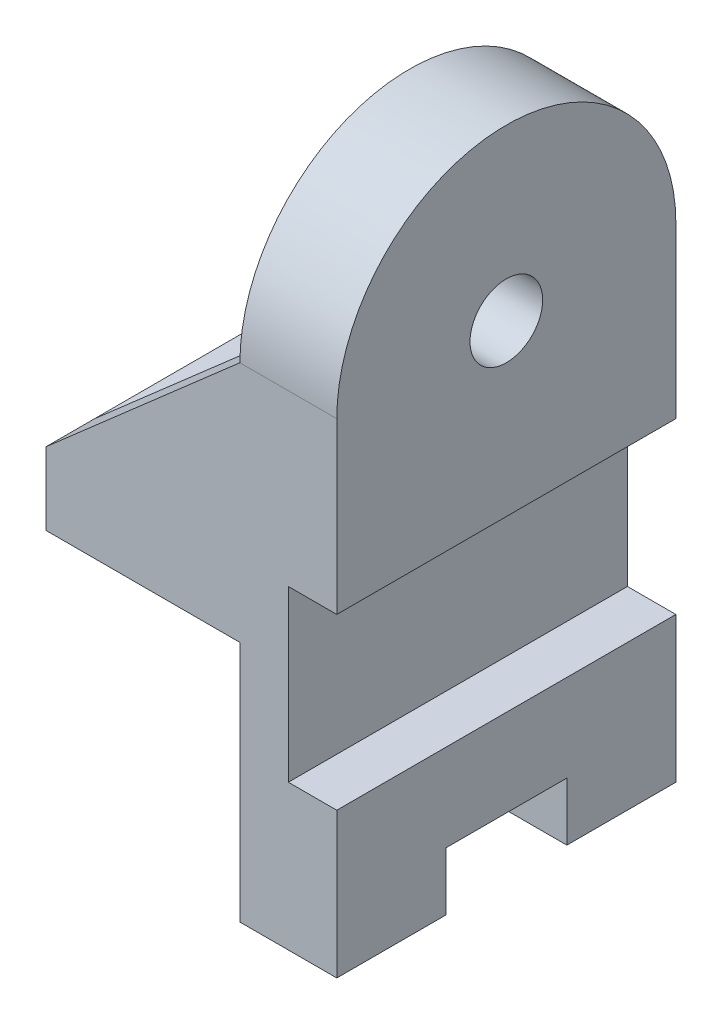
ISO-10303-21;
HEADER;
FILE_DESCRIPTION(('STEP AP214'),'2;1');
FILE_NAME('part.step','',(''),(''),'','','');
FILE_SCHEMA(('AUTOMOTIVE_DESIGN { 1 0 10303 214 1 1 1 1 }'));
ENDSEC;
DATA;
#1=APPLICATION_CONTEXT('core data for automotive mechanical design processes');
#2=APPLICATION_PROTOCOL_DEFINITION('international standard','automotive_design',2000,#1);
#3=PRODUCT_CONTEXT('',#1,'mechanical');
#4=PRODUCT('Part','Part','',(#3));
#5=PRODUCT_RELATED_PRODUCT_CATEGORY('part','',(#4));
#6=PRODUCT_DEFINITION_FORMATION('','',#4);
#7=PRODUCT_DEFINITION_CONTEXT('part definition',#1,'design');
#8=PRODUCT_DEFINITION('design','',#6,#7);
#9=PRODUCT_DEFINITION_SHAPE('','',#8);
#10=(LENGTH_UNIT() NAMED_UNIT(*) SI_UNIT(.MILLI.,.METRE.));
#11=(NAMED_UNIT(*) PLANE_ANGLE_UNIT() SI_UNIT($,.RADIAN.));
#12=(NAMED_UNIT(*) SI_UNIT($,.STERADIAN.) SOLID_ANGLE_UNIT());
#13=UNCERTAINTY_MEASURE_WITH_UNIT(LENGTH_MEASURE(1.E-05),#10,'distance_accuracy_value','');
#14=(GEOMETRIC_REPRESENTATION_CONTEXT(3) GLOBAL_UNCERTAINTY_ASSIGNED_CONTEXT((#13)) GLOBAL_UNIT_ASSIGNED_CONTEXT((#10,
#11,#12)) REPRESENTATION_CONTEXT('',''));
#15=CARTESIAN_POINT('',(0.,0.,0.));
#16=DIRECTION('',(0.,0.,1.));
#17=DIRECTION('',(1.,0.,0.));
#18=AXIS2_PLACEMENT_3D('',#15,#16,#17);
#19=CARTESIAN_POINT('',(-20.,15.,-77.7200187265877));
#20=DIRECTION('',(0.,1.,0.));
#21=DIRECTION('',(-1.,0.,0.));
#22=AXIS2_PLACEMENT_3D('',#19,#20,#21);
#23=PLANE('',#22);
#24=CARTESIAN_POINT('',(-40.,15.,0.));
#25=DIRECTION('',(0.,1.,0.));
#26=DIRECTION('',(-1.,0.,0.));
#27=AXIS2_PLACEMENT_3D('',#24,#25,#26);
#28=CIRCLE('',#27,6.);
#29=CARTESIAN_POINT('',(-46.,15.,0.));
#30=VERTEX_POINT('',#29);
#31=EDGE_CURVE('E346',#30,#30,#28,.T.);
#32=ORIENTED_EDGE('',*,*,#31,.F.);
#33=EDGE_LOOP('',(#32));
#34=FACE_BOUND('',#33,.T.);
#35=DIRECTION('',(0.,0.,1.));
#36=VECTOR('',#35,1.);
#37=CARTESIAN_POINT('',(-20.,15.,-77.7200187265877));
#38=LINE('',#37,#36);
#39=CARTESIAN_POINT('',(-20.,15.,-25.));
#40=VERTEX_POINT('',#39);
#41=CARTESIAN_POINT('',(-20.,15.,25.));
#42=VERTEX_POINT('',#41);
#43=EDGE_CURVE('E41',#40,#42,#38,.T.);
#44=ORIENTED_EDGE('',*,*,#43,.F.);
#45=DIRECTION('',(1.,0.,0.));
#46=VECTOR('',#45,1.);
#47=CARTESIAN_POINT('',(-20.,15.,-25.));
#48=LINE('',#47,#46);
#49=CARTESIAN_POINT('',(-60.,15.,-25.));
#50=VERTEX_POINT('',#49);
#51=EDGE_CURVE('E178',#50,#40,#48,.T.);
#52=ORIENTED_EDGE('',*,*,#51,.F.);
#53=DIRECTION('',(0.,0.,1.));
#54=VECTOR('',#53,1.);
#55=CARTESIAN_POINT('',(-60.,15.,-77.7200187265877));
#56=LINE('',#55,#54);
#57=CARTESIAN_POINT('',(-60.,15.,25.));
#58=VERTEX_POINT('',#57);
#59=EDGE_CURVE('E163',#50,#58,#56,.T.);
#60=ORIENTED_EDGE('',*,*,#59,.T.);
#61=DIRECTION('',(1.,0.,0.));
#62=VECTOR('',#61,1.);
#63=CARTESIAN_POINT('',(-20.,15.,25.));
#64=LINE('',#63,#62);
#65=EDGE_CURVE('E491',#58,#42,#64,.T.);
#66=ORIENTED_EDGE('',*,*,#65,.T.);
#67=EDGE_LOOP('',(#44,#52,#60,#66));
#68=FACE_BOUND('',#67,.T.);
#69=ADVANCED_FACE('F37',(#34,#68),#23,.T.);
#70=CARTESIAN_POINT('',(-20.,0.,0.));
#71=DIRECTION('',(1.,0.,0.));
#72=DIRECTION('',(0.,0.,-1.));
#73=AXIS2_PLACEMENT_3D('',#70,#71,#72);
#74=PLANE('',#73);
#75=CARTESIAN_POINT('',(-20.,50.,0.));
#76=DIRECTION('',(1.,0.,0.));
#77=DIRECTION('',(0.,0.,-1.));
#78=AXIS2_PLACEMENT_3D('',#75,#76,#77);
#79=CIRCLE('',#78,7.5);
#80=CARTESIAN_POINT('',(-20.,50.,-7.5));
#81=VERTEX_POINT('',#80);
#82=EDGE_CURVE('E224',#81,#81,#79,.T.);
#83=ORIENTED_EDGE('',*,*,#82,.T.);
#84=EDGE_LOOP('',(#83));
#85=FACE_BOUND('',#84,.T.);
#86=DIRECTION('',(0.,0.,-1.));
#87=VECTOR('',#86,1.);
#88=CARTESIAN_POINT('',(-20.,50.,-25.));
#89=LINE('',#88,#87);
#90=CARTESIAN_POINT('',(-20.,50.,-25.));
#91=VERTEX_POINT('',#90);
#92=CARTESIAN_POINT('',(-20.,50.,-35.));
#93=VERTEX_POINT('',#92);
#94=EDGE_CURVE('E55',#91,#93,#89,.T.);
#95=ORIENTED_EDGE('',*,*,#94,.F.);
#96=DIRECTION('',(0.,1.,0.));
#97=VECTOR('',#96,1.);
#98=CARTESIAN_POINT('',(-20.,50.,-25.));
#99=LINE('',#98,#97);
#100=EDGE_CURVE('E59',#40,#91,#99,.T.);
#101=ORIENTED_EDGE('',*,*,#100,.F.);
#102=ORIENTED_EDGE('',*,*,#43,.T.);
#103=DIRECTION('',(0.,1.,0.));
#104=VECTOR('',#103,1.);
#105=CARTESIAN_POINT('',(-20.,50.,25.));
#106=LINE('',#105,#104);
#107=CARTESIAN_POINT('',(-20.,50.,25.));
#108=VERTEX_POINT('',#107);
#109=EDGE_CURVE('E493',#42,#108,#106,.T.);
#110=ORIENTED_EDGE('',*,*,#109,.T.);
#111=DIRECTION('',(0.,0.,1.));
#112=VECTOR('',#111,1.);
#113=CARTESIAN_POINT('',(-20.,50.,25.));
#114=LINE('',#113,#112);
#115=CARTESIAN_POINT('',(-20.,50.,35.));
#116=VERTEX_POINT('',#115);
#117=EDGE_CURVE('E489',#108,#116,#114,.T.);
#118=ORIENTED_EDGE('',*,*,#117,.T.);
#119=CARTESIAN_POINT('',(-20.,50.,0.));
#120=DIRECTION('',(1.,0.,0.));
#121=DIRECTION('',(0.,0.,-1.));
#122=AXIS2_PLACEMENT_3D('',#119,#120,#121);
#123=CIRCLE('',#122,35.);
#124=EDGE_CURVE('E231',#93,#116,#123,.T.);
#125=ORIENTED_EDGE('',*,*,#124,.F.);
#126=EDGE_LOOP('',(#95,#101,#102,#110,#118,#125));
#127=FACE_BOUND('',#126,.T.);
#128=ADVANCED_FACE('F371',(#85,#127),#74,.F.);
#129=DIRECTION('',(0.,0.,1.));
#130=VECTOR('',#129,1.);
#131=CARTESIAN_POINT('',(-20.,0.,-77.7200187265877));
#132=LINE('',#131,#130);
#133=CARTESIAN_POINT('',(-20.,0.,-35.));
#134=VERTEX_POINT('',#133);
#135=CARTESIAN_POINT('',(-20.,0.,35.));
#136=VERTEX_POINT('',#135);
#137=EDGE_CURVE('E243',#134,#136,#132,.T.);
#138=ORIENTED_EDGE('',*,*,#137,.F.);
#139=DIRECTION('',(0.,1.,0.));
#140=VECTOR('',#139,1.);
#141=CARTESIAN_POINT('',(-20.,0.,-35.));
#142=LINE('',#141,#140);
#143=CARTESIAN_POINT('',(-20.,-50.,-35.));
#144=VERTEX_POINT('',#143);
#145=EDGE_CURVE('E227',#144,#134,#142,.T.);
#146=ORIENTED_EDGE('',*,*,#145,.F.);
#147=DIRECTION('',(0.,0.,-1.));
#148=VECTOR('',#147,1.);
#149=CARTESIAN_POINT('',(-20.,-50.,0.));
#150=LINE('',#149,#148);
#151=CARTESIAN_POINT('',(-20.,-50.,-12.5));
#152=VERTEX_POINT('',#151);
#153=EDGE_CURVE('E250',#152,#144,#150,.T.);
#154=ORIENTED_EDGE('',*,*,#153,.F.);
#155=DIRECTION('',(0.,-1.,0.));
#156=VECTOR('',#155,1.);
#157=CARTESIAN_POINT('',(-20.,0.,-12.5));
#158=LINE('',#157,#156);
#159=CARTESIAN_POINT('',(-20.,-38.,-12.5));
#160=VERTEX_POINT('',#159);
#161=EDGE_CURVE('E255',#160,#152,#158,.T.);
#162=ORIENTED_EDGE('',*,*,#161,.F.);
#163=DIRECTION('',(0.,0.,-1.));
#164=VECTOR('',#163,1.);
#165=CARTESIAN_POINT('',(-20.,-38.,0.));
#166=LINE('',#165,#164);
#167=CARTESIAN_POINT('',(-20.,-38.,12.5));
#168=VERTEX_POINT('',#167);
#169=EDGE_CURVE('E252',#168,#160,#166,.T.);
#170=ORIENTED_EDGE('',*,*,#169,.F.);
#171=DIRECTION('',(0.,-1.,0.));
#172=VECTOR('',#171,1.);
#173=CARTESIAN_POINT('',(-20.,0.,12.5));
#174=LINE('',#173,#172);
#175=CARTESIAN_POINT('',(-20.,-50.,12.5));
#176=VERTEX_POINT('',#175);
#177=EDGE_CURVE('E249',#168,#176,#174,.T.);
#178=ORIENTED_EDGE('',*,*,#177,.T.);
#179=CARTESIAN_POINT('',(-20.,-50.,35.));
#180=VERTEX_POINT('',#179);
#181=EDGE_CURVE('E242',#180,#176,#150,.T.);
#182=ORIENTED_EDGE('',*,*,#181,.F.);
#183=DIRECTION('',(0.,1.,0.));
#184=VECTOR('',#183,1.);
#185=CARTESIAN_POINT('',(-20.,0.,35.));
#186=LINE('',#185,#184);
#187=EDGE_CURVE('E239',#180,#136,#186,.T.);
#188=ORIENTED_EDGE('',*,*,#187,.T.);
#189=EDGE_LOOP('',(#138,#146,#154,#162,#170,#178,#182,#188));
#190=FACE_BOUND('',#189,.T.);
#191=ADVANCED_FACE('F310',(#190),#74,.F.);
#192=CARTESIAN_POINT('',(0.,0.,0.));
#193=DIRECTION('',(1.,0.,0.));
#194=DIRECTION('',(0.,0.,-1.));
#195=AXIS2_PLACEMENT_3D('',#192,#193,#194);
#196=PLANE('',#195);
#197=DIRECTION('',(0.,0.,-1.));
#198=VECTOR('',#197,1.);
#199=CARTESIAN_POINT('',(0.,15.,35.));
#200=LINE('',#199,#198);
#201=CARTESIAN_POINT('',(0.,15.,35.));
#202=VERTEX_POINT('',#201);
#203=CARTESIAN_POINT('',(0.,15.,-35.));
#204=VERTEX_POINT('',#203);
#205=EDGE_CURVE('E215',#202,#204,#200,.T.);
#206=ORIENTED_EDGE('',*,*,#205,.T.);
#207=DIRECTION('',(0.,1.,0.));
#208=VECTOR('',#207,1.);
#209=CARTESIAN_POINT('',(0.,0.,-35.));
#210=LINE('',#209,#208);
#211=CARTESIAN_POINT('',(0.,50.,-35.));
#212=VERTEX_POINT('',#211);
#213=EDGE_CURVE('E260',#204,#212,#210,.T.);
#214=ORIENTED_EDGE('',*,*,#213,.T.);
#215=CARTESIAN_POINT('',(0.,50.,0.));
#216=DIRECTION('',(1.,0.,0.));
#217=DIRECTION('',(0.,0.,-1.));
#218=AXIS2_PLACEMENT_3D('',#215,#216,#217);
#219=CIRCLE('',#218,35.);
#220=CARTESIAN_POINT('',(0.,50.,35.));
#221=VERTEX_POINT('',#220);
#222=EDGE_CURVE('E264',#212,#221,#219,.T.);
#223=ORIENTED_EDGE('',*,*,#222,.T.);
#224=DIRECTION('',(0.,1.,0.));
#225=VECTOR('',#224,1.);
#226=CARTESIAN_POINT('',(0.,0.,35.));
#227=LINE('',#226,#225);
#228=EDGE_CURVE('E267',#202,#221,#227,.T.);
#229=ORIENTED_EDGE('',*,*,#228,.F.);
#230=EDGE_LOOP('',(#206,#214,#223,#229));
#231=FACE_BOUND('',#230,.T.);
#232=CARTESIAN_POINT('',(0.,50.,0.));
#233=DIRECTION('',(1.,0.,0.));
#234=DIRECTION('',(0.,0.,-1.));
#235=AXIS2_PLACEMENT_3D('',#232,#233,#234);
#236=CIRCLE('',#235,7.5);
#237=CARTESIAN_POINT('',(0.,50.,-7.5));
#238=VERTEX_POINT('',#237);
#239=EDGE_CURVE('E218',#238,#238,#236,.T.);
#240=ORIENTED_EDGE('',*,*,#239,.F.);
#241=EDGE_LOOP('',(#240));
#242=FACE_BOUND('',#241,.T.);
#243=ADVANCED_FACE('F395',(#231,#242),#196,.T.);
#244=CARTESIAN_POINT('',(-20.,0.,-35.));
#245=DIRECTION('',(0.,0.,-1.));
#246=DIRECTION('',(-1.,0.,0.));
#247=AXIS2_PLACEMENT_3D('',#244,#245,#246);
#248=PLANE('',#247);
#249=DIRECTION('',(0.,-1.,0.));
#250=VECTOR('',#249,1.);
#251=CARTESIAN_POINT('',(-60.,15.,-35.));
#252=LINE('',#251,#250);
#253=CARTESIAN_POINT('',(-60.,15.,-35.));
#254=VERTEX_POINT('',#253);
#255=CARTESIAN_POINT('',(-60.,0.,-35.));
#256=VERTEX_POINT('',#255);
#257=EDGE_CURVE('E190',#254,#256,#252,.T.);
#258=ORIENTED_EDGE('',*,*,#257,.F.);
#259=DIRECTION('',(-0.752576694706878,-0.658504607868518,0.));
#260=VECTOR('',#259,1.);
#261=CARTESIAN_POINT('',(-60.,15.,-35.));
#262=LINE('',#261,#260);
#263=EDGE_CURVE('E182',#93,#254,#262,.T.);
#264=ORIENTED_EDGE('',*,*,#263,.F.);
#265=DIRECTION('',(1.,0.,0.));
#266=VECTOR('',#265,1.);
#267=CARTESIAN_POINT('',(-20.,50.,-35.));
#268=LINE('',#267,#266);
#269=EDGE_CURVE('E237',#93,#212,#268,.T.);
#270=ORIENTED_EDGE('',*,*,#269,.T.);
#271=ORIENTED_EDGE('',*,*,#213,.F.);
#272=DIRECTION('',(1.,0.,0.));
#273=VECTOR('',#272,1.);
#274=CARTESIAN_POINT('',(-9.99999999999999,15.,-35.));
#275=LINE('',#274,#273);
#276=CARTESIAN_POINT('',(-9.99999999999999,15.,-35.));
#277=VERTEX_POINT('',#276);
#278=EDGE_CURVE('E201',#277,#204,#275,.T.);
#279=ORIENTED_EDGE('',*,*,#278,.F.);
#280=DIRECTION('',(0.,1.,0.));
#281=VECTOR('',#280,1.);
#282=CARTESIAN_POINT('',(-9.99999999999999,15.,-35.));
#283=LINE('',#282,#281);
#284=CARTESIAN_POINT('',(-10.,-20.,-35.));
#285=VERTEX_POINT('',#284);
#286=EDGE_CURVE('E211',#285,#277,#283,.T.);
#287=ORIENTED_EDGE('',*,*,#286,.F.);
#288=DIRECTION('',(-1.,0.,0.));
#289=VECTOR('',#288,1.);
#290=CARTESIAN_POINT('',(-10.,-20.,-35.));
#291=LINE('',#290,#289);
#292=CARTESIAN_POINT('',(0.,-20.,-35.));
#293=VERTEX_POINT('',#292);
#294=EDGE_CURVE('E208',#293,#285,#291,.T.);
#295=ORIENTED_EDGE('',*,*,#294,.F.);
#296=CARTESIAN_POINT('',(0.,-50.,-35.));
#297=VERTEX_POINT('',#296);
#298=EDGE_CURVE('E261',#297,#293,#210,.T.);
#299=ORIENTED_EDGE('',*,*,#298,.F.);
#300=DIRECTION('',(1.,0.,0.));
#301=VECTOR('',#300,1.);
#302=CARTESIAN_POINT('',(-20.,-50.,-35.));
#303=LINE('',#302,#301);
#304=EDGE_CURVE('E11',#144,#297,#303,.T.);
#305=ORIENTED_EDGE('',*,*,#304,.F.);
#306=ORIENTED_EDGE('',*,*,#145,.T.);
#307=DIRECTION('',(1.,0.,0.));
#308=VECTOR('',#307,1.);
#309=CARTESIAN_POINT('',(-20.,0.,-35.));
#310=LINE('',#309,#308);
#311=EDGE_CURVE('E313',#256,#134,#310,.T.);
#312=ORIENTED_EDGE('',*,*,#311,.F.);
#313=EDGE_LOOP('',(#258,#264,#270,#271,#279,#287,#295,#299,#305,#306,#312));
#314=FACE_BOUND('',#313,.T.);
#315=ADVANCED_FACE('F312',(#314),#248,.T.);
#316=CARTESIAN_POINT('',(-20.,-50.,0.));
#317=DIRECTION('',(0.,-1.,0.));
#318=DIRECTION('',(0.,0.,-1.));
#319=AXIS2_PLACEMENT_3D('',#316,#317,#318);
#320=PLANE('',#319);
#321=DIRECTION('',(0.,0.,-1.));
#322=VECTOR('',#321,1.);
#323=CARTESIAN_POINT('',(0.,-50.,0.));
#324=LINE('',#323,#322);
#325=CARTESIAN_POINT('',(0.,-50.,-12.5));
#326=VERTEX_POINT('',#325);
#327=EDGE_CURVE('E228',#326,#297,#324,.T.);
#328=ORIENTED_EDGE('',*,*,#327,.F.);
#329=DIRECTION('',(1.,0.,0.));
#330=VECTOR('',#329,1.);
#331=CARTESIAN_POINT('',(-20.,-50.,-12.5));
#332=LINE('',#331,#330);
#333=EDGE_CURVE('E47',#152,#326,#332,.T.);
#334=ORIENTED_EDGE('',*,*,#333,.F.);
#335=ORIENTED_EDGE('',*,*,#153,.T.);
#336=ORIENTED_EDGE('',*,*,#304,.T.);
#337=EDGE_LOOP('',(#328,#334,#335,#336));
#338=FACE_BOUND('',#337,.T.);
#339=ADVANCED_FACE('F304',(#338),#320,.T.);
#340=CARTESIAN_POINT('',(-20.,0.,-12.5));
#341=DIRECTION('',(0.,0.,1.));
#342=DIRECTION('',(1.,0.,0.));
#343=AXIS2_PLACEMENT_3D('',#340,#341,#342);
#344=PLANE('',#343);
#345=DIRECTION('',(0.,-1.,0.));
#346=VECTOR('',#345,1.);
#347=CARTESIAN_POINT('',(0.,0.,-12.5));
#348=LINE('',#347,#346);
#349=CARTESIAN_POINT('',(0.,-38.,-12.5));
#350=VERTEX_POINT('',#349);
#351=EDGE_CURVE('E280',#350,#326,#348,.T.);
#352=ORIENTED_EDGE('',*,*,#351,.F.);
#353=DIRECTION('',(1.,0.,0.));
#354=VECTOR('',#353,1.);
#355=CARTESIAN_POINT('',(-20.,-38.,-12.5));
#356=LINE('',#355,#354);
#357=EDGE_CURVE('E284',#160,#350,#356,.T.);
#358=ORIENTED_EDGE('',*,*,#357,.F.);
#359=ORIENTED_EDGE('',*,*,#161,.T.);
#360=ORIENTED_EDGE('',*,*,#333,.T.);
#361=EDGE_LOOP('',(#352,#358,#359,#360));
#362=FACE_BOUND('',#361,.T.);
#363=ADVANCED_FACE('F325',(#362),#344,.T.);
#364=CARTESIAN_POINT('',(-20.,-38.,0.));
#365=DIRECTION('',(0.,-1.,0.));
#366=DIRECTION('',(0.,0.,-1.));
#367=AXIS2_PLACEMENT_3D('',#364,#365,#366);
#368=PLANE('',#367);
#369=DIRECTION('',(0.,0.,-1.));
#370=VECTOR('',#369,1.);
#371=CARTESIAN_POINT('',(0.,-38.,0.));
#372=LINE('',#371,#370);
#373=CARTESIAN_POINT('',(0.,-38.,12.5));
#374=VERTEX_POINT('',#373);
#375=EDGE_CURVE('E277',#374,#350,#372,.T.);
#376=ORIENTED_EDGE('',*,*,#375,.F.);
#377=DIRECTION('',(1.,0.,0.));
#378=VECTOR('',#377,1.);
#379=CARTESIAN_POINT('',(-20.,-38.,12.5));
#380=LINE('',#379,#378);
#381=EDGE_CURVE('E286',#168,#374,#380,.T.);
#382=ORIENTED_EDGE('',*,*,#381,.F.);
#383=ORIENTED_EDGE('',*,*,#169,.T.);
#384=ORIENTED_EDGE('',*,*,#357,.T.);
#385=EDGE_LOOP('',(#376,#382,#383,#384));
#386=FACE_BOUND('',#385,.T.);
#387=ADVANCED_FACE('F327',(#386),#368,.T.);
#388=CARTESIAN_POINT('',(-20.,0.,12.5));
#389=DIRECTION('',(0.,0.,1.));
#390=DIRECTION('',(0.,-1.,0.));
#391=AXIS2_PLACEMENT_3D('',#388,#389,#390);
#392=PLANE('',#391);
#393=DIRECTION('',(0.,-1.,0.));
#394=VECTOR('',#393,1.);
#395=CARTESIAN_POINT('',(0.,0.,12.5));
#396=LINE('',#395,#394);
#397=CARTESIAN_POINT('',(0.,-50.,12.5));
#398=VERTEX_POINT('',#397);
#399=EDGE_CURVE('E274',#374,#398,#396,.T.);
#400=ORIENTED_EDGE('',*,*,#399,.T.);
#401=DIRECTION('',(1.,0.,0.));
#402=VECTOR('',#401,1.);
#403=CARTESIAN_POINT('',(-20.,-50.,12.5));
#404=LINE('',#403,#402);
#405=EDGE_CURVE('E288',#176,#398,#404,.T.);
#406=ORIENTED_EDGE('',*,*,#405,.F.);
#407=ORIENTED_EDGE('',*,*,#177,.F.);
#408=ORIENTED_EDGE('',*,*,#381,.T.);
#409=EDGE_LOOP('',(#400,#406,#407,#408));
#410=FACE_BOUND('',#409,.T.);
#411=ADVANCED_FACE('F332',(#410),#392,.F.);
#412=CARTESIAN_POINT('',(0.,-50.,35.));
#413=VERTEX_POINT('',#412);
#414=EDGE_CURVE('E271',#413,#398,#324,.T.);
#415=ORIENTED_EDGE('',*,*,#414,.F.);
#416=DIRECTION('',(1.,0.,0.));
#417=VECTOR('',#416,1.);
#418=CARTESIAN_POINT('',(-20.,-50.,35.));
#419=LINE('',#418,#417);
#420=EDGE_CURVE('E290',#180,#413,#419,.T.);
#421=ORIENTED_EDGE('',*,*,#420,.F.);
#422=ORIENTED_EDGE('',*,*,#181,.T.);
#423=ORIENTED_EDGE('',*,*,#405,.T.);
#424=EDGE_LOOP('',(#415,#421,#422,#423));
#425=FACE_BOUND('',#424,.T.);
#426=ADVANCED_FACE('F335',(#425),#320,.T.);
#427=CARTESIAN_POINT('',(-20.,0.,35.));
#428=DIRECTION('',(0.,0.,-1.));
#429=DIRECTION('',(-1.,0.,0.));
#430=AXIS2_PLACEMENT_3D('',#427,#428,#429);
#431=PLANE('',#430);
#432=DIRECTION('',(1.,0.,0.));
#433=VECTOR('',#432,1.);
#434=CARTESIAN_POINT('',(-20.,50.,35.));
#435=LINE('',#434,#433);
#436=EDGE_CURVE('E291',#116,#221,#435,.T.);
#437=ORIENTED_EDGE('',*,*,#436,.F.);
#438=DIRECTION('',(-0.752576694706878,-0.658504607868518,0.));
#439=VECTOR('',#438,1.);
#440=CARTESIAN_POINT('',(-60.,15.,35.));
#441=LINE('',#440,#439);
#442=CARTESIAN_POINT('',(-60.,15.,35.));
#443=VERTEX_POINT('',#442);
#444=EDGE_CURVE('E487',#116,#443,#441,.T.);
#445=ORIENTED_EDGE('',*,*,#444,.T.);
#446=DIRECTION('',(0.,1.,0.));
#447=VECTOR('',#446,1.);
#448=CARTESIAN_POINT('',(-60.,15.,35.));
#449=LINE('',#448,#447);
#450=CARTESIAN_POINT('',(-60.,0.,35.));
#451=VERTEX_POINT('',#450);
#452=EDGE_CURVE('E175',#451,#443,#449,.T.);
#453=ORIENTED_EDGE('',*,*,#452,.F.);
#454=DIRECTION('',(-1.,0.,0.));
#455=VECTOR('',#454,1.);
#456=CARTESIAN_POINT('',(-20.,0.,35.));
#457=LINE('',#456,#455);
#458=EDGE_CURVE('E343',#136,#451,#457,.T.);
#459=ORIENTED_EDGE('',*,*,#458,.F.);
#460=ORIENTED_EDGE('',*,*,#187,.F.);
#461=ORIENTED_EDGE('',*,*,#420,.T.);
#462=CARTESIAN_POINT('',(0.,-20.,35.));
#463=VERTEX_POINT('',#462);
#464=EDGE_CURVE('E268',#413,#463,#227,.T.);
#465=ORIENTED_EDGE('',*,*,#464,.T.);
#466=DIRECTION('',(-1.,0.,0.));
#467=VECTOR('',#466,1.);
#468=CARTESIAN_POINT('',(-10.,-20.,35.));
#469=LINE('',#468,#467);
#470=CARTESIAN_POINT('',(-10.,-20.,35.));
#471=VERTEX_POINT('',#470);
#472=EDGE_CURVE('E197',#463,#471,#469,.T.);
#473=ORIENTED_EDGE('',*,*,#472,.T.);
#474=DIRECTION('',(0.,1.,0.));
#475=VECTOR('',#474,1.);
#476=CARTESIAN_POINT('',(-9.99999999999999,15.,35.));
#477=LINE('',#476,#475);
#478=CARTESIAN_POINT('',(-9.99999999999999,15.,35.));
#479=VERTEX_POINT('',#478);
#480=EDGE_CURVE('E200',#471,#479,#477,.T.);
#481=ORIENTED_EDGE('',*,*,#480,.T.);
#482=DIRECTION('',(1.,0.,0.));
#483=VECTOR('',#482,1.);
#484=CARTESIAN_POINT('',(-9.99999999999999,15.,35.));
#485=LINE('',#484,#483);
#486=EDGE_CURVE('E204',#479,#202,#485,.T.);
#487=ORIENTED_EDGE('',*,*,#486,.T.);
#488=ORIENTED_EDGE('',*,*,#228,.T.);
#489=EDGE_LOOP('',(#437,#445,#453,#459,#460,#461,#465,#473,#481,#487,#488));
#490=FACE_BOUND('',#489,.T.);
#491=ADVANCED_FACE('F340',(#490),#431,.F.);
#492=CARTESIAN_POINT('',(-20.,50.,0.));
#493=DIRECTION('',(1.,0.,0.));
#494=DIRECTION('',(0.,0.,-1.));
#495=AXIS2_PLACEMENT_3D('',#492,#493,#494);
#496=CYLINDRICAL_SURFACE('',#495,7.5);
#497=ORIENTED_EDGE('',*,*,#82,.F.);
#498=EDGE_LOOP('',(#497));
#499=FACE_BOUND('',#498,.T.);
#500=ORIENTED_EDGE('',*,*,#239,.T.);
#501=EDGE_LOOP('',(#500));
#502=FACE_BOUND('',#501,.T.);
#503=ADVANCED_FACE('F39',(#499,#502),#496,.F.);
#504=CARTESIAN_POINT('',(-20.,50.,0.));
#505=DIRECTION('',(1.,0.,0.));
#506=DIRECTION('',(0.,0.,-1.));
#507=AXIS2_PLACEMENT_3D('',#504,#505,#506);
#508=CYLINDRICAL_SURFACE('',#507,35.);
#509=ORIENTED_EDGE('',*,*,#222,.F.);
#510=ORIENTED_EDGE('',*,*,#269,.F.);
#511=ORIENTED_EDGE('',*,*,#124,.T.);
#512=ORIENTED_EDGE('',*,*,#436,.T.);
#513=EDGE_LOOP('',(#509,#510,#511,#512));
#514=FACE_BOUND('',#513,.T.);
#515=ADVANCED_FACE('F394',(#514),#508,.T.);
#516=DIRECTION('',(0.,0.,-1.));
#517=VECTOR('',#516,1.);
#518=CARTESIAN_POINT('',(0.,-20.,35.));
#519=LINE('',#518,#517);
#520=EDGE_CURVE('E207',#463,#293,#519,.T.);
#521=ORIENTED_EDGE('',*,*,#520,.F.);
#522=ORIENTED_EDGE('',*,*,#464,.F.);
#523=ORIENTED_EDGE('',*,*,#414,.T.);
#524=ORIENTED_EDGE('',*,*,#399,.F.);
#525=ORIENTED_EDGE('',*,*,#375,.T.);
#526=ORIENTED_EDGE('',*,*,#351,.T.);
#527=ORIENTED_EDGE('',*,*,#327,.T.);
#528=ORIENTED_EDGE('',*,*,#298,.T.);
#529=EDGE_LOOP('',(#521,#522,#523,#524,#525,#526,#527,#528));
#530=FACE_BOUND('',#529,.T.);
#531=ADVANCED_FACE('F320',(#530),#196,.T.);
#532=CARTESIAN_POINT('',(-9.99999999999999,15.,35.));
#533=DIRECTION('',(0.,1.,0.));
#534=DIRECTION('',(0.,0.,1.));
#535=AXIS2_PLACEMENT_3D('',#532,#533,#534);
#536=PLANE('',#535);
#537=ORIENTED_EDGE('',*,*,#278,.T.);
#538=ORIENTED_EDGE('',*,*,#205,.F.);
#539=ORIENTED_EDGE('',*,*,#486,.F.);
#540=DIRECTION('',(0.,0.,-1.));
#541=VECTOR('',#540,1.);
#542=CARTESIAN_POINT('',(-9.99999999999999,15.,35.));
#543=LINE('',#542,#541);
#544=EDGE_CURVE('E219',#479,#277,#543,.T.);
#545=ORIENTED_EDGE('',*,*,#544,.T.);
#546=EDGE_LOOP('',(#537,#538,#539,#545));
#547=FACE_BOUND('',#546,.T.);
#548=ADVANCED_FACE('F381',(#547),#536,.F.);
#549=CARTESIAN_POINT('',(-9.99999999999999,15.,35.));
#550=DIRECTION('',(-1.,0.,0.));
#551=DIRECTION('',(0.,-1.,0.));
#552=AXIS2_PLACEMENT_3D('',#549,#550,#551);
#553=PLANE('',#552);
#554=ORIENTED_EDGE('',*,*,#286,.T.);
#555=ORIENTED_EDGE('',*,*,#544,.F.);
#556=ORIENTED_EDGE('',*,*,#480,.F.);
#557=DIRECTION('',(0.,0.,-1.));
#558=VECTOR('',#557,1.);
#559=CARTESIAN_POINT('',(-10.,-20.,35.));
#560=LINE('',#559,#558);
#561=EDGE_CURVE('E221',#471,#285,#560,.T.);
#562=ORIENTED_EDGE('',*,*,#561,.T.);
#563=EDGE_LOOP('',(#554,#555,#556,#562));
#564=FACE_BOUND('',#563,.T.);
#565=ADVANCED_FACE('F384',(#564),#553,.F.);
#566=CARTESIAN_POINT('',(-10.,-20.,35.));
#567=DIRECTION('',(0.,-1.,0.));
#568=DIRECTION('',(0.,0.,-1.));
#569=AXIS2_PLACEMENT_3D('',#566,#567,#568);
#570=PLANE('',#569);
#571=ORIENTED_EDGE('',*,*,#294,.T.);
#572=ORIENTED_EDGE('',*,*,#561,.F.);
#573=ORIENTED_EDGE('',*,*,#472,.F.);
#574=ORIENTED_EDGE('',*,*,#520,.T.);
#575=EDGE_LOOP('',(#571,#572,#573,#574));
#576=FACE_BOUND('',#575,.T.);
#577=ADVANCED_FACE('F367',(#576),#570,.F.);
#578=CARTESIAN_POINT('',(-60.,15.,-77.7200187265877));
#579=DIRECTION('',(-1.,0.,0.));
#580=DIRECTION('',(0.,0.,1.));
#581=AXIS2_PLACEMENT_3D('',#578,#579,#580);
#582=PLANE('',#581);
#583=EDGE_CURVE('E168',#254,#50,#56,.T.);
#584=ORIENTED_EDGE('',*,*,#583,.F.);
#585=ORIENTED_EDGE('',*,*,#257,.T.);
#586=DIRECTION('',(0.,0.,1.));
#587=VECTOR('',#586,1.);
#588=CARTESIAN_POINT('',(-60.,0.,-77.7200187265877));
#589=LINE('',#588,#587);
#590=EDGE_CURVE('E191',#256,#451,#589,.T.);
#591=ORIENTED_EDGE('',*,*,#590,.T.);
#592=ORIENTED_EDGE('',*,*,#452,.T.);
#593=DIRECTION('',(0.,0.,1.));
#594=VECTOR('',#593,1.);
#595=CARTESIAN_POINT('',(-60.,15.,25.));
#596=LINE('',#595,#594);
#597=EDGE_CURVE('E171',#58,#443,#596,.T.);
#598=ORIENTED_EDGE('',*,*,#597,.F.);
#599=ORIENTED_EDGE('',*,*,#59,.F.);
#600=EDGE_LOOP('',(#584,#585,#591,#592,#598,#599));
#601=FACE_BOUND('',#600,.T.);
#602=ADVANCED_FACE('F165',(#601),#582,.T.);
#603=CARTESIAN_POINT('',(-20.,0.,-77.7200187265877));
#604=DIRECTION('',(0.,-1.,0.));
#605=DIRECTION('',(1.,0.,0.));
#606=AXIS2_PLACEMENT_3D('',#603,#604,#605);
#607=PLANE('',#606);
#608=CARTESIAN_POINT('',(-40.,0.,0.));
#609=DIRECTION('',(0.,-1.,0.));
#610=DIRECTION('',(1.,0.,0.));
#611=AXIS2_PLACEMENT_3D('',#608,#609,#610);
#612=CIRCLE('',#611,6.);
#613=CARTESIAN_POINT('',(-34.,0.,0.));
#614=VERTEX_POINT('',#613);
#615=EDGE_CURVE('E350',#614,#614,#612,.T.);
#616=ORIENTED_EDGE('',*,*,#615,.F.);
#617=EDGE_LOOP('',(#616));
#618=FACE_BOUND('',#617,.T.);
#619=ORIENTED_EDGE('',*,*,#590,.F.);
#620=ORIENTED_EDGE('',*,*,#311,.T.);
#621=ORIENTED_EDGE('',*,*,#137,.T.);
#622=ORIENTED_EDGE('',*,*,#458,.T.);
#623=EDGE_LOOP('',(#619,#620,#621,#622));
#624=FACE_BOUND('',#623,.T.);
#625=ADVANCED_FACE('F355',(#618,#624),#607,.T.);
#626=CARTESIAN_POINT('',(-40.,85.,0.));
#627=DIRECTION('',(0.,-1.,0.));
#628=DIRECTION('',(1.,0.,0.));
#629=AXIS2_PLACEMENT_3D('',#626,#627,#628);
#630=CYLINDRICAL_SURFACE('',#629,6.);
#631=ORIENTED_EDGE('',*,*,#31,.T.);
#632=EDGE_LOOP('',(#631));
#633=FACE_BOUND('',#632,.T.);
#634=ORIENTED_EDGE('',*,*,#615,.T.);
#635=EDGE_LOOP('',(#634));
#636=FACE_BOUND('',#635,.T.);
#637=ADVANCED_FACE('F357',(#633,#636),#630,.F.);
#638=CARTESIAN_POINT('',(-60.,15.,25.));
#639=DIRECTION('',(-0.658504607868518,0.752576694706878,0.));
#640=DIRECTION('',(-0.752576694706878,-0.658504607868518,0.));
#641=AXIS2_PLACEMENT_3D('',#638,#639,#640);
#642=PLANE('',#641);
#643=ORIENTED_EDGE('',*,*,#444,.F.);
#644=ORIENTED_EDGE('',*,*,#117,.F.);
#645=DIRECTION('',(-0.752576694706878,-0.658504607868518,0.));
#646=VECTOR('',#645,1.);
#647=CARTESIAN_POINT('',(-60.,15.,25.));
#648=LINE('',#647,#646);
#649=EDGE_CURVE('E498',#108,#58,#648,.T.);
#650=ORIENTED_EDGE('',*,*,#649,.T.);
#651=ORIENTED_EDGE('',*,*,#597,.T.);
#652=EDGE_LOOP('',(#643,#644,#650,#651));
#653=FACE_BOUND('',#652,.T.);
#654=ADVANCED_FACE('F364',(#653),#642,.T.);
#655=CARTESIAN_POINT('',(0.,0.,25.));
#656=DIRECTION('',(0.,0.,1.));
#657=DIRECTION('',(1.,0.,0.));
#658=AXIS2_PLACEMENT_3D('',#655,#656,#657);
#659=PLANE('',#658);
#660=ORIENTED_EDGE('',*,*,#65,.F.);
#661=ORIENTED_EDGE('',*,*,#649,.F.);
#662=ORIENTED_EDGE('',*,*,#109,.F.);
#663=EDGE_LOOP('',(#660,#661,#662));
#664=FACE_BOUND('',#663,.T.);
#665=ADVANCED_FACE('F464',(#664),#659,.F.);
#666=CARTESIAN_POINT('',(-60.,15.,-25.));
#667=DIRECTION('',(0.658504607868518,-0.752576694706878,0.));
#668=DIRECTION('',(0.752576694706878,0.658504607868518,0.));
#669=AXIS2_PLACEMENT_3D('',#666,#667,#668);
#670=PLANE('',#669);
#671=ORIENTED_EDGE('',*,*,#263,.T.);
#672=ORIENTED_EDGE('',*,*,#583,.T.);
#673=DIRECTION('',(-0.752576694706878,-0.658504607868518,0.));
#674=VECTOR('',#673,1.);
#675=CARTESIAN_POINT('',(-60.,15.,-25.));
#676=LINE('',#675,#674);
#677=EDGE_CURVE('E181',#91,#50,#676,.T.);
#678=ORIENTED_EDGE('',*,*,#677,.F.);
#679=ORIENTED_EDGE('',*,*,#94,.T.);
#680=EDGE_LOOP('',(#671,#672,#678,#679));
#681=FACE_BOUND('',#680,.T.);
#682=ADVANCED_FACE('F188',(#681),#670,.F.);
#683=CARTESIAN_POINT('',(0.,0.,-25.));
#684=DIRECTION('',(0.,0.,-1.));
#685=DIRECTION('',(1.,0.,0.));
#686=AXIS2_PLACEMENT_3D('',#683,#684,#685);
#687=PLANE('',#686);
#688=ORIENTED_EDGE('',*,*,#51,.T.);
#689=ORIENTED_EDGE('',*,*,#100,.T.);
#690=ORIENTED_EDGE('',*,*,#677,.T.);
#691=EDGE_LOOP('',(#688,#689,#690));
#692=FACE_BOUND('',#691,.T.);
#693=ADVANCED_FACE('F185',(#692),#687,.F.);
#694=CLOSED_SHELL('',(#69,#128,#191,#243,#315,#339,#363,#387,#411,#426,#491,#503,#515,#531,#548,
#565,#577,#602,#625,#637,#654,#665,#682,#693));
#695=MANIFOLD_SOLID_BREP('B2',#694);
#696=ADVANCED_BREP_SHAPE_REPRESENTATION('',(#18,#695),#14);
#697=SHAPE_DEFINITION_REPRESENTATION(#9,#696);
ENDSEC;
END-ISO-10303-21;
